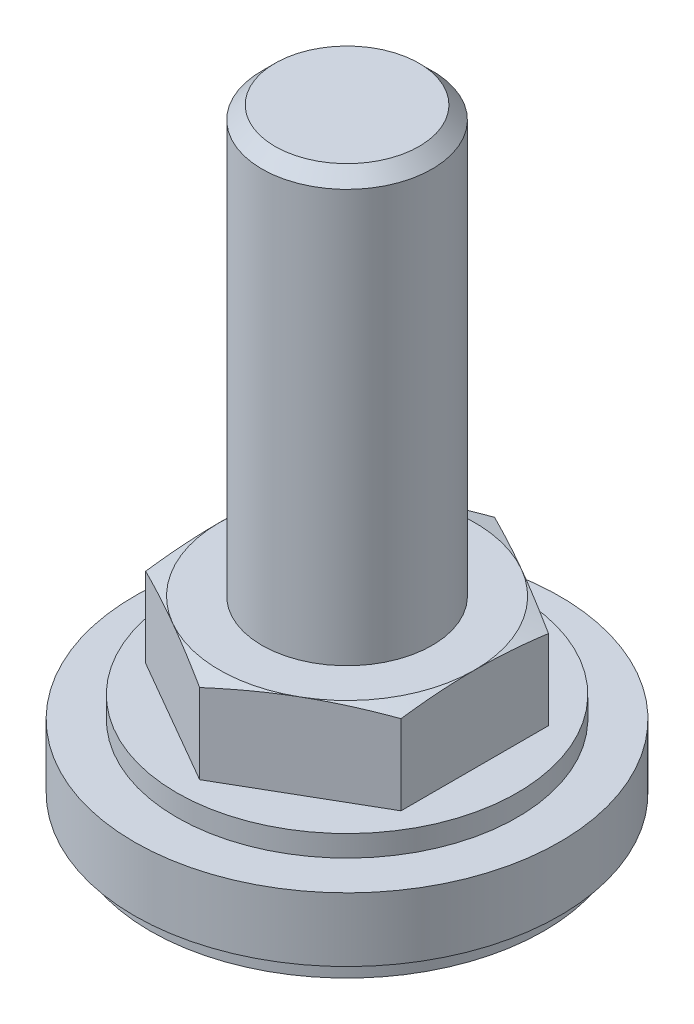
ISO-10303-21;
HEADER;
FILE_DESCRIPTION(('STEP AP214'),'2;1');
FILE_NAME('part.step','',(''),(''),'','','');
FILE_SCHEMA(('AUTOMOTIVE_DESIGN { 1 0 10303 214 1 1 1 1 }'));
ENDSEC;
DATA;
#1=APPLICATION_CONTEXT('core data for automotive mechanical design processes');
#2=APPLICATION_PROTOCOL_DEFINITION('international standard','automotive_design',2000,#1);
#3=PRODUCT_CONTEXT('',#1,'mechanical');
#4=PRODUCT('Part','Part','',(#3));
#5=PRODUCT_RELATED_PRODUCT_CATEGORY('part','',(#4));
#6=PRODUCT_DEFINITION_FORMATION('','',#4);
#7=PRODUCT_DEFINITION_CONTEXT('part definition',#1,'design');
#8=PRODUCT_DEFINITION('design','',#6,#7);
#9=PRODUCT_DEFINITION_SHAPE('','',#8);
#10=(LENGTH_UNIT() NAMED_UNIT(*) SI_UNIT(.MILLI.,.METRE.));
#11=(NAMED_UNIT(*) PLANE_ANGLE_UNIT() SI_UNIT($,.RADIAN.));
#12=(NAMED_UNIT(*) SI_UNIT($,.STERADIAN.) SOLID_ANGLE_UNIT());
#13=UNCERTAINTY_MEASURE_WITH_UNIT(LENGTH_MEASURE(1.E-05),#10,'distance_accuracy_value','');
#14=(GEOMETRIC_REPRESENTATION_CONTEXT(3) GLOBAL_UNCERTAINTY_ASSIGNED_CONTEXT((#13)) GLOBAL_UNIT_ASSIGNED_CONTEXT((#10,
#11,#12)) REPRESENTATION_CONTEXT('',''));
#15=CARTESIAN_POINT('',(0.,0.,0.));
#16=DIRECTION('',(0.,0.,1.));
#17=DIRECTION('',(1.,0.,0.));
#18=AXIS2_PLACEMENT_3D('',#15,#16,#17);
#19=CARTESIAN_POINT('',(15.,2.,0.));
#20=DIRECTION('',(0.,-1.,0.));
#21=DIRECTION('',(0.,0.,-1.));
#22=AXIS2_PLACEMENT_3D('',#19,#20,#21);
#23=PLANE('',#22);
#24=CARTESIAN_POINT('',(0.,2.,0.));
#25=DIRECTION('',(0.,1.,0.));
#26=DIRECTION('',(0.,0.,1.));
#27=AXIS2_PLACEMENT_3D('',#24,#25,#26);
#28=CIRCLE('',#27,16.);
#29=CARTESIAN_POINT('',(0.,2.,16.));
#30=VERTEX_POINT('',#29);
#31=EDGE_CURVE('E167',#30,#30,#28,.T.);
#32=ORIENTED_EDGE('',*,*,#31,.T.);
#33=EDGE_LOOP('',(#32));
#34=FACE_BOUND('',#33,.T.);
#35=DIRECTION('',(0.,0.,1.));
#36=VECTOR('',#35,1.);
#37=CARTESIAN_POINT('',(-12.,2.,-6.92820323027551));
#38=LINE('',#37,#36);
#39=CARTESIAN_POINT('',(-12.,2.,-6.92820323027551));
#40=VERTEX_POINT('',#39);
#41=CARTESIAN_POINT('',(-12.,2.,6.92820323027551));
#42=VERTEX_POINT('',#41);
#43=EDGE_CURVE('E128',#40,#42,#38,.T.);
#44=ORIENTED_EDGE('',*,*,#43,.F.);
#45=DIRECTION('',(-0.866025403784439,0.,0.5));
#46=VECTOR('',#45,1.);
#47=CARTESIAN_POINT('',(0.,2.,-13.856406460551));
#48=LINE('',#47,#46);
#49=CARTESIAN_POINT('',(0.,2.,-13.856406460551));
#50=VERTEX_POINT('',#49);
#51=EDGE_CURVE('E143',#50,#40,#48,.T.);
#52=ORIENTED_EDGE('',*,*,#51,.F.);
#53=DIRECTION('',(-0.866025403784439,0.,-0.5));
#54=VECTOR('',#53,1.);
#55=CARTESIAN_POINT('',(12.,2.,-6.92820323027551));
#56=LINE('',#55,#54);
#57=CARTESIAN_POINT('',(12.,2.,-6.92820323027551));
#58=VERTEX_POINT('',#57);
#59=EDGE_CURVE('E140',#58,#50,#56,.T.);
#60=ORIENTED_EDGE('',*,*,#59,.F.);
#61=DIRECTION('',(0.,0.,-1.));
#62=VECTOR('',#61,1.);
#63=CARTESIAN_POINT('',(12.,2.,6.92820323027551));
#64=LINE('',#63,#62);
#65=CARTESIAN_POINT('',(12.,2.,6.92820323027551));
#66=VERTEX_POINT('',#65);
#67=EDGE_CURVE('E137',#66,#58,#64,.T.);
#68=ORIENTED_EDGE('',*,*,#67,.F.);
#69=DIRECTION('',(0.866025403784439,0.,-0.5));
#70=VECTOR('',#69,1.);
#71=CARTESIAN_POINT('',(0.,2.,13.856406460551));
#72=LINE('',#71,#70);
#73=CARTESIAN_POINT('',(0.,2.,13.856406460551));
#74=VERTEX_POINT('',#73);
#75=EDGE_CURVE('E131',#74,#66,#72,.T.);
#76=ORIENTED_EDGE('',*,*,#75,.F.);
#77=DIRECTION('',(0.866025403784439,0.,0.5));
#78=VECTOR('',#77,1.);
#79=CARTESIAN_POINT('',(-12.,2.,6.92820323027551));
#80=LINE('',#79,#78);
#81=EDGE_CURVE('E117',#42,#74,#80,.T.);
#82=ORIENTED_EDGE('',*,*,#81,.F.);
#83=EDGE_LOOP('',(#44,#52,#60,#68,#76,#82));
#84=FACE_BOUND('',#83,.T.);
#85=ADVANCED_FACE('F39',(#34,#84),#23,.F.);
#86=CARTESIAN_POINT('',(0.,-8.,0.));
#87=DIRECTION('',(0.,1.,0.));
#88=DIRECTION('',(0.,0.,1.));
#89=AXIS2_PLACEMENT_3D('',#86,#87,#88);
#90=CYLINDRICAL_SURFACE('',#89,16.);
#91=ORIENTED_EDGE('',*,*,#31,.F.);
#92=EDGE_LOOP('',(#91));
#93=FACE_BOUND('',#92,.T.);
#94=CARTESIAN_POINT('',(0.,0.,0.));
#95=DIRECTION('',(0.,1.,0.));
#96=DIRECTION('',(0.,0.,1.));
#97=AXIS2_PLACEMENT_3D('',#94,#95,#96);
#98=CIRCLE('',#97,16.);
#99=CARTESIAN_POINT('',(0.,0.,16.));
#100=VERTEX_POINT('',#99);
#101=EDGE_CURVE('E164',#100,#100,#98,.T.);
#102=ORIENTED_EDGE('',*,*,#101,.T.);
#103=EDGE_LOOP('',(#102));
#104=FACE_BOUND('',#103,.T.);
#105=ADVANCED_FACE('F261',(#93,#104),#90,.T.);
#106=CARTESIAN_POINT('',(16.,0.,0.));
#107=DIRECTION('',(0.,-1.,0.));
#108=DIRECTION('',(0.,0.,-1.));
#109=AXIS2_PLACEMENT_3D('',#106,#107,#108);
#110=PLANE('',#109);
#111=ORIENTED_EDGE('',*,*,#101,.F.);
#112=EDGE_LOOP('',(#111));
#113=FACE_BOUND('',#112,.T.);
#114=CARTESIAN_POINT('',(0.,0.,0.));
#115=DIRECTION('',(0.,1.,0.));
#116=DIRECTION('',(0.,0.,1.));
#117=AXIS2_PLACEMENT_3D('',#114,#115,#116);
#118=CIRCLE('',#117,20.);
#119=CARTESIAN_POINT('',(0.,0.,20.));
#120=VERTEX_POINT('',#119);
#121=EDGE_CURVE('E161',#120,#120,#118,.T.);
#122=ORIENTED_EDGE('',*,*,#121,.T.);
#123=EDGE_LOOP('',(#122));
#124=FACE_BOUND('',#123,.T.);
#125=ADVANCED_FACE('F257',(#113,#124),#110,.F.);
#126=CARTESIAN_POINT('',(0.,-8.,0.));
#127=DIRECTION('',(0.,1.,0.));
#128=DIRECTION('',(0.,0.,1.));
#129=AXIS2_PLACEMENT_3D('',#126,#127,#128);
#130=CYLINDRICAL_SURFACE('',#129,20.);
#131=ORIENTED_EDGE('',*,*,#121,.F.);
#132=EDGE_LOOP('',(#131));
#133=FACE_BOUND('',#132,.T.);
#134=CARTESIAN_POINT('',(0.,-6.,0.));
#135=DIRECTION('',(0.,1.,0.));
#136=DIRECTION('',(0.,0.,1.));
#137=AXIS2_PLACEMENT_3D('',#134,#135,#136);
#138=CIRCLE('',#137,20.);
#139=CARTESIAN_POINT('',(0.,-6.,20.));
#140=VERTEX_POINT('',#139);
#141=EDGE_CURVE('E158',#140,#140,#138,.T.);
#142=ORIENTED_EDGE('',*,*,#141,.T.);
#143=EDGE_LOOP('',(#142));
#144=FACE_BOUND('',#143,.T.);
#145=ADVANCED_FACE('F253',(#133,#144),#130,.T.);
#146=CARTESIAN_POINT('',(20.,-6.,0.));
#147=DIRECTION('',(0.,1.,0.));
#148=DIRECTION('',(0.,0.,1.));
#149=AXIS2_PLACEMENT_3D('',#146,#147,#148);
#150=PLANE('',#149);
#151=ORIENTED_EDGE('',*,*,#141,.F.);
#152=EDGE_LOOP('',(#151));
#153=FACE_BOUND('',#152,.T.);
#154=CARTESIAN_POINT('',(0.,-6.,0.));
#155=DIRECTION('',(0.,1.,0.));
#156=DIRECTION('',(0.,0.,1.));
#157=AXIS2_PLACEMENT_3D('',#154,#155,#156);
#158=CIRCLE('',#157,18.5);
#159=CARTESIAN_POINT('',(0.,-6.,18.5));
#160=VERTEX_POINT('',#159);
#161=EDGE_CURVE('E155',#160,#160,#158,.T.);
#162=ORIENTED_EDGE('',*,*,#161,.T.);
#163=EDGE_LOOP('',(#162));
#164=FACE_BOUND('',#163,.T.);
#165=ADVANCED_FACE('F249',(#153,#164),#150,.F.);
#166=CARTESIAN_POINT('',(0.,-8.,0.));
#167=DIRECTION('',(0.,1.,0.));
#168=DIRECTION('',(0.,0.,1.));
#169=AXIS2_PLACEMENT_3D('',#166,#167,#168);
#170=CYLINDRICAL_SURFACE('',#169,18.5);
#171=ORIENTED_EDGE('',*,*,#161,.F.);
#172=EDGE_LOOP('',(#171));
#173=FACE_BOUND('',#172,.T.);
#174=CARTESIAN_POINT('',(0.,-8.,0.));
#175=DIRECTION('',(0.,1.,0.));
#176=DIRECTION('',(0.,0.,1.));
#177=AXIS2_PLACEMENT_3D('',#174,#175,#176);
#178=CIRCLE('',#177,18.5);
#179=CARTESIAN_POINT('',(0.,-8.,18.5));
#180=VERTEX_POINT('',#179);
#181=EDGE_CURVE('E121',#180,#180,#178,.T.);
#182=ORIENTED_EDGE('',*,*,#181,.T.);
#183=EDGE_LOOP('',(#182));
#184=FACE_BOUND('',#183,.T.);
#185=ADVANCED_FACE('F245',(#173,#184),#170,.T.);
#186=CARTESIAN_POINT('',(18.5,-8.,0.));
#187=DIRECTION('',(0.,1.,0.));
#188=DIRECTION('',(0.,0.,1.));
#189=AXIS2_PLACEMENT_3D('',#186,#187,#188);
#190=PLANE('',#189);
#191=ORIENTED_EDGE('',*,*,#181,.F.);
#192=EDGE_LOOP('',(#191));
#193=FACE_BOUND('',#192,.T.);
#194=ADVANCED_FACE('F242',(#193),#190,.F.);
#195=CARTESIAN_POINT('',(-12.,12.,-6.92820323027551));
#196=DIRECTION('',(1.,0.,0.));
#197=DIRECTION('',(0.,0.,-1.));
#198=AXIS2_PLACEMENT_3D('',#195,#196,#197);
#199=PLANE('',#198);
#200=DIRECTION('',(0.,-1.,0.));
#201=VECTOR('',#200,1.);
#202=CARTESIAN_POINT('',(-12.,12.,-6.92820323027551));
#203=LINE('',#202,#201);
#204=CARTESIAN_POINT('',(-12.,9.50257738807144,-6.92820323027551));
#205=VERTEX_POINT('',#204);
#206=EDGE_CURVE('E59',#205,#40,#203,.T.);
#207=ORIENTED_EDGE('',*,*,#206,.T.);
#208=ORIENTED_EDGE('',*,*,#43,.T.);
#209=DIRECTION('',(0.,-1.,0.));
#210=VECTOR('',#209,1.);
#211=CARTESIAN_POINT('',(-12.,12.,6.92820323027551));
#212=LINE('',#211,#210);
#213=CARTESIAN_POINT('',(-12.,9.50257738807144,6.92820323027551));
#214=VERTEX_POINT('',#213);
#215=EDGE_CURVE('E113',#214,#42,#212,.T.);
#216=ORIENTED_EDGE('',*,*,#215,.F.);
#217=CARTESIAN_POINT('',(-12.,7.34291336878938,-18.3392424451288));
#218=CARTESIAN_POINT('',(-12.,7.46497416598965,-17.7947049298608));
#219=CARTESIAN_POINT('',(-12.,7.58554409265667,-17.2498271442394));
#220=CARTESIAN_POINT('',(-12.,7.82289745119736,-16.1592238953871));
#221=CARTESIAN_POINT('',(-12.,7.93968071989154,-15.6134983966846));
#222=CARTESIAN_POINT('',(-12.,8.16875730516589,-14.5205453408895));
#223=CARTESIAN_POINT('',(-12.,8.28104611977105,-13.9733168368444));
#224=CARTESIAN_POINT('',(-12.,8.49992361427316,-12.8777216682163));
#225=CARTESIAN_POINT('',(-12.,8.60651234215723,-12.3293550132554));
#226=CARTESIAN_POINT('',(-12.,8.81180976479951,-11.2356630729952));
#227=CARTESIAN_POINT('',(-12.,8.91057446126407,-10.6903483516512));
#228=CARTESIAN_POINT('',(-12.,9.09949648601528,-9.59821809665814));
#229=CARTESIAN_POINT('',(-12.,9.18965378238088,-9.05140255745102));
#230=CARTESIAN_POINT('',(-12.,9.35932947152392,-7.95618411484281));
#231=CARTESIAN_POINT('',(-12.,9.43884929024633,-7.40778143428583));
#232=CARTESIAN_POINT('',(-12.,9.58491017293834,-6.30923056644194));
#233=CARTESIAN_POINT('',(-12.,9.65145122425651,-5.75908237745407));
#234=CARTESIAN_POINT('',(-12.,9.76967287965022,-4.65082902866329));
#235=CARTESIAN_POINT('',(-12.,9.82117560154871,-4.09270460781781));
#236=CARTESIAN_POINT('',(-12.,9.90576919917668,-2.97505012677679));
#237=CARTESIAN_POINT('',(-12.,9.93886049717467,-2.41552009911472));
#238=CARTESIAN_POINT('',(-12.,9.98470135997272,-1.29586637312656));
#239=CARTESIAN_POINT('',(-12.,9.99746021195907,-0.735743062852366));
#240=CARTESIAN_POINT('',(-12.,10.0018514734413,0.384587539379178));
#241=CARTESIAN_POINT('',(-12.,9.99348390320361,0.944794831255455));
#242=CARTESIAN_POINT('',(-12.,9.95609280857339,2.06654492461965));
#243=CARTESIAN_POINT('',(-12.,9.92699428380419,2.62808517501098));
#244=CARTESIAN_POINT('',(-12.,9.84980336617103,3.74984659854216));
#245=CARTESIAN_POINT('',(-12.,9.80171055196485,4.31006774214349));
#246=CARTESIAN_POINT('',(-12.,9.68896323837323,5.42918593727119));
#247=CARTESIAN_POINT('',(-12.,9.62429790423961,5.98808188023556));
#248=CARTESIAN_POINT('',(-12.,9.4810999066988,7.10407465120835));
#249=CARTESIAN_POINT('',(-12.,9.40256719974487,7.66117147356152));
#250=CARTESIAN_POINT('',(-12.,9.23961453136396,8.73752812609933));
#251=CARTESIAN_POINT('',(-12.,9.15590747706429,9.25689698586229));
#252=CARTESIAN_POINT('',(-12.,8.98035073248432,10.294263454863));
#253=CARTESIAN_POINT('',(-12.,8.88850081864786,10.8122610260507));
#254=CARTESIAN_POINT('',(-12.,8.69814696950544,11.8470802784051));
#255=CARTESIAN_POINT('',(-12.,8.59964236069907,12.3639018350633));
#256=CARTESIAN_POINT('',(-12.,8.39720736973758,13.3964724543178));
#257=CARTESIAN_POINT('',(-12.,8.29327703700343,13.9122215266385));
#258=CARTESIAN_POINT('',(-12.,8.08094711168316,14.9429248833211));
#259=CARTESIAN_POINT('',(-12.,7.97254645648657,15.4578789481757));
#260=CARTESIAN_POINT('',(-12.,7.75207795037087,16.4870026127467));
#261=CARTESIAN_POINT('',(-12.,7.64001007807679,17.0011722078723));
#262=CARTESIAN_POINT('',(-12.,7.29929681010787,18.5426103722024));
#263=CARTESIAN_POINT('',(-12.,7.06612711042525,19.5688785132233));
#264=CARTESIAN_POINT('',(-12.,6.59370922187564,21.6093738155767));
#265=CARTESIAN_POINT('',(-12.,6.35454333578601,22.6236201570885));
#266=CARTESIAN_POINT('',(-12.,5.8702257601212,24.6506997888533));
#267=CARTESIAN_POINT('',(-12.,5.62507396088436,25.6635330528589));
#268=CARTESIAN_POINT('',(-12.,5.1306458534958,27.6868599239905));
#269=CARTESIAN_POINT('',(-12.,4.88137503425515,28.6973548750466));
#270=CARTESIAN_POINT('',(-12.,4.50495264739508,30.2124536801021));
#271=CARTESIAN_POINT('',(-12.,4.37906121183352,30.7173711972522));
#272=CARTESIAN_POINT('',(-12.,4.12653530428738,31.7270198362654));
#273=CARTESIAN_POINT('',(-12.,3.99990083310313,32.2317509583285));
#274=CARTESIAN_POINT('',(-12.,3.87294319801609,32.7364007742963));
#275=B_SPLINE_CURVE_WITH_KNOTS('',3,(#217,#218,#219,#220,#221,#222,#223,#224,#225,#226,#227,
#228,#229,#230,#231,#232,#233,#234,#235,#236,#237,#238,#239,#240,#241,#242,#243,#244,#245,#246,
#247,#248,#249,#250,#251,#252,#253,#254,#255,#256,#257,#258,#259,#260,#261,#262,#263,#264,#265,
#266,#267,#268,#269,#270,#271,#272,#273,#274),.UNSPECIFIED.,.F.,.F.,(4,2,2,2,2,2,2,2,2,2,2,2,2,
2,2,2,2,2,2,2,2,2,2,2,2,2,2,2,4),(0.,1.67415717844079,3.34838640617016,5.02425271091023,
6.70010490486635,8.36260910905425,10.0251194784959,11.6874067660145,13.3496956738876,
15.030916953375,16.7120996722342,18.3925142623134,20.0729272403843,21.7594506855859,
23.4460115443176,25.1336778647815,26.8213494849987,28.3994866240126,29.977667103039,
31.5560075446455,33.134333612225,34.7130370404334,36.2917496720076,39.4489598327135,
42.5751286078004,45.7013546972023,48.8237058684811,50.3848310405374,51.9459545314085),.UNSPECIFIED.);
#276=CARTESIAN_POINT('',(-12.,10.,0.));
#277=VERTEX_POINT('',#276);
#278=EDGE_CURVE('E43',#277,#214,#275,.T.);
#279=ORIENTED_EDGE('',*,*,#278,.F.);
#280=EDGE_CURVE('E11',#205,#277,#275,.T.);
#281=ORIENTED_EDGE('',*,*,#280,.F.);
#282=EDGE_LOOP('',(#207,#208,#216,#279,#281));
#283=FACE_BOUND('',#282,.T.);
#284=ADVANCED_FACE('F133',(#283),#199,.F.);
#285=CARTESIAN_POINT('',(-12.,12.,6.92820323027551));
#286=DIRECTION('',(0.5,0.,-0.866025403784439));
#287=DIRECTION('',(-0.866025403784439,0.,-0.5));
#288=AXIS2_PLACEMENT_3D('',#285,#286,#287);
#289=PLANE('',#288);
#290=ORIENTED_EDGE('',*,*,#215,.T.);
#291=ORIENTED_EDGE('',*,*,#81,.T.);
#292=DIRECTION('',(0.,-1.,0.));
#293=VECTOR('',#292,1.);
#294=CARTESIAN_POINT('',(0.,12.,13.856406460551));
#295=LINE('',#294,#293);
#296=CARTESIAN_POINT('',(0.,9.50257738807144,13.856406460551));
#297=VERTEX_POINT('',#296);
#298=EDGE_CURVE('E122',#297,#74,#295,.T.);
#299=ORIENTED_EDGE('',*,*,#298,.F.);
#300=CARTESIAN_POINT('',(-12.0002,9.50254644757701,6.92808776022167));
#301=CARTESIAN_POINT('',(-11.5018535458174,9.57967201341546,7.21580821969369));
#302=CARTESIAN_POINT('',(-11.0026035553764,9.64968920259279,7.50405033606775));
#303=CARTESIAN_POINT('',(-10.0023405010804,9.7727027206488,8.08155247972595));
#304=CARTESIAN_POINT('',(-9.50132680443088,9.82569213655645,8.37081287235424));
#305=CARTESIAN_POINT('',(-8.50057386663493,9.91155672804192,8.94859785038305));
#306=CARTESIAN_POINT('',(-8.00084139202275,9.94453429696096,9.23711852912318));
#307=CARTESIAN_POINT('',(-7.00073918358372,9.98875383045164,9.8145278083826));
#308=CARTESIAN_POINT('',(-6.50036959179186,10.,10.1034163268979));
#309=CARTESIAN_POINT('',(-5.49963040820814,10.,10.6811933639286));
#310=CARTESIAN_POINT('',(-4.99926081641628,9.98875383045164,10.9700818824439));
#311=CARTESIAN_POINT('',(-3.99915860797725,9.94453429696096,11.5474911617033));
#312=CARTESIAN_POINT('',(-3.49942613336507,9.91155672804192,11.8360118404435));
#313=CARTESIAN_POINT('',(-2.49867319556912,9.82569213655645,12.4137968184723));
#314=CARTESIAN_POINT('',(-1.99765949891959,9.7727027206488,12.7030572111006));
#315=CARTESIAN_POINT('',(-0.997396444623651,9.64968920259279,13.2805593547588));
#316=CARTESIAN_POINT('',(-0.498146454182601,9.57967201341546,13.5688014711328));
#317=CARTESIAN_POINT('',(0.00019999999999816,9.50254644757701,13.8565219306049));
#318=B_SPLINE_CURVE_WITH_KNOTS('',3,(#300,#301,#302,#303,#304,#305,#306,#307,#308,#309,#310,
#311,#312,#313,#314,#315,#316,#317),.UNSPECIFIED.,.F.,.F.,(4,2,2,2,2,2,2,2,4),(0.,
1.74185054469228,3.48440735870376,5.21797126724055,6.95119970147062,8.6844281357007,
10.4179920442375,12.160548858249,13.9023994029412),.UNSPECIFIED.);
#319=CARTESIAN_POINT('',(-6.,10.,10.3923048454133));
#320=VERTEX_POINT('',#319);
#321=EDGE_CURVE('E232',#320,#297,#318,.T.);
#322=ORIENTED_EDGE('',*,*,#321,.F.);
#323=EDGE_CURVE('E119',#214,#320,#318,.T.);
#324=ORIENTED_EDGE('',*,*,#323,.F.);
#325=EDGE_LOOP('',(#290,#291,#299,#322,#324));
#326=FACE_BOUND('',#325,.T.);
#327=ADVANCED_FACE('F115',(#326),#289,.F.);
#328=CARTESIAN_POINT('',(0.,12.,13.856406460551));
#329=DIRECTION('',(-0.5,0.,-0.866025403784439));
#330=DIRECTION('',(-0.866025403784439,0.,0.5));
#331=AXIS2_PLACEMENT_3D('',#328,#329,#330);
#332=PLANE('',#331);
#333=ORIENTED_EDGE('',*,*,#298,.T.);
#334=ORIENTED_EDGE('',*,*,#75,.T.);
#335=DIRECTION('',(0.,-1.,0.));
#336=VECTOR('',#335,1.);
#337=CARTESIAN_POINT('',(12.,12.,6.92820323027551));
#338=LINE('',#337,#336);
#339=CARTESIAN_POINT('',(12.,9.50257738807144,6.92820323027551));
#340=VERTEX_POINT('',#339);
#341=EDGE_CURVE('E150',#340,#66,#338,.T.);
#342=ORIENTED_EDGE('',*,*,#341,.F.);
#343=CARTESIAN_POINT('',(-0.000200000000000077,9.50254644757701,13.8565219306049));
#344=CARTESIAN_POINT('',(0.498146454182599,9.57967201341546,13.5688014711328));
#345=CARTESIAN_POINT('',(0.997396444623648,9.64968920259279,13.2805593547588));
#346=CARTESIAN_POINT('',(1.99765949891959,9.7727027206488,12.7030572111006));
#347=CARTESIAN_POINT('',(2.49867319556912,9.82569213655645,12.4137968184723));
#348=CARTESIAN_POINT('',(3.49942613336507,9.91155672804192,11.8360118404435));
#349=CARTESIAN_POINT('',(3.99915860797725,9.94453429696096,11.5474911617033));
#350=CARTESIAN_POINT('',(4.99926081641628,9.98875383045164,10.9700818824439));
#351=CARTESIAN_POINT('',(5.49963040820814,10.,10.6811933639286));
#352=CARTESIAN_POINT('',(6.50036959179186,10.,10.1034163268979));
#353=CARTESIAN_POINT('',(7.00073918358372,9.98875383045164,9.8145278083826));
#354=CARTESIAN_POINT('',(8.00084139202275,9.94453429696096,9.23711852912318));
#355=CARTESIAN_POINT('',(8.50057386663493,9.91155672804192,8.94859785038305));
#356=CARTESIAN_POINT('',(9.50132680443088,9.82569213655645,8.37081287235424));
#357=CARTESIAN_POINT('',(10.0023405010804,9.7727027206488,8.08155247972595));
#358=CARTESIAN_POINT('',(11.0026035553764,9.64968920259279,7.50405033606775));
#359=CARTESIAN_POINT('',(11.5018535458174,9.57967201341546,7.21580821969369));
#360=CARTESIAN_POINT('',(12.0002,9.50254644757701,6.92808776022167));
#361=B_SPLINE_CURVE_WITH_KNOTS('',3,(#343,#344,#345,#346,#347,#348,#349,#350,#351,#352,#353,
#354,#355,#356,#357,#358,#359,#360),.UNSPECIFIED.,.F.,.F.,(4,2,2,2,2,2,2,2,4),(0.,
1.74185054469228,3.48440735870376,5.21797126724055,6.95119970147062,8.68442813570069,
10.4179920442375,12.160548858249,13.9023994029412),.UNSPECIFIED.);
#362=CARTESIAN_POINT('',(6.,10.,10.3923048454133));
#363=VERTEX_POINT('',#362);
#364=EDGE_CURVE('E226',#363,#340,#361,.T.);
#365=ORIENTED_EDGE('',*,*,#364,.F.);
#366=EDGE_CURVE('E231',#297,#363,#361,.T.);
#367=ORIENTED_EDGE('',*,*,#366,.F.);
#368=EDGE_LOOP('',(#333,#334,#342,#365,#367));
#369=FACE_BOUND('',#368,.T.);
#370=ADVANCED_FACE('F214',(#369),#332,.F.);
#371=CARTESIAN_POINT('',(12.,12.,6.92820323027551));
#372=DIRECTION('',(-1.,0.,0.));
#373=DIRECTION('',(0.,0.,1.));
#374=AXIS2_PLACEMENT_3D('',#371,#372,#373);
#375=PLANE('',#374);
#376=ORIENTED_EDGE('',*,*,#341,.T.);
#377=ORIENTED_EDGE('',*,*,#67,.T.);
#378=DIRECTION('',(0.,-1.,0.));
#379=VECTOR('',#378,1.);
#380=CARTESIAN_POINT('',(12.,12.,-6.92820323027551));
#381=LINE('',#380,#379);
#382=CARTESIAN_POINT('',(12.,9.50257738807144,-6.92820323027551));
#383=VERTEX_POINT('',#382);
#384=EDGE_CURVE('E148',#383,#58,#381,.T.);
#385=ORIENTED_EDGE('',*,*,#384,.F.);
#386=CARTESIAN_POINT('',(12.,7.34291336878938,-18.3392424451288));
#387=CARTESIAN_POINT('',(12.,7.46497416598965,-17.7947049298608));
#388=CARTESIAN_POINT('',(12.,7.58554409265667,-17.2498271442394));
#389=CARTESIAN_POINT('',(12.,7.82289745119736,-16.1592238953871));
#390=CARTESIAN_POINT('',(12.,7.93968071989154,-15.6134983966846));
#391=CARTESIAN_POINT('',(12.,8.16875730516589,-14.5205453408895));
#392=CARTESIAN_POINT('',(12.,8.28104611977105,-13.9733168368444));
#393=CARTESIAN_POINT('',(12.,8.49992361427316,-12.8777216682163));
#394=CARTESIAN_POINT('',(12.,8.60651234215723,-12.3293550132554));
#395=CARTESIAN_POINT('',(12.,8.81180976479951,-11.2356630729952));
#396=CARTESIAN_POINT('',(12.,8.91057446126407,-10.6903483516512));
#397=CARTESIAN_POINT('',(12.,9.09949648601528,-9.59821809665814));
#398=CARTESIAN_POINT('',(12.,9.18965378238088,-9.05140255745102));
#399=CARTESIAN_POINT('',(12.,9.35932947152392,-7.95618411484281));
#400=CARTESIAN_POINT('',(12.,9.43884929024633,-7.40778143428583));
#401=CARTESIAN_POINT('',(12.,9.58491017293834,-6.30923056644194));
#402=CARTESIAN_POINT('',(12.,9.65145122425651,-5.75908237745407));
#403=CARTESIAN_POINT('',(12.,9.76967287965022,-4.65082902866329));
#404=CARTESIAN_POINT('',(12.,9.82117560154871,-4.09270460781781));
#405=CARTESIAN_POINT('',(12.,9.90576919917668,-2.97505012677679));
#406=CARTESIAN_POINT('',(12.,9.93886049717467,-2.41552009911472));
#407=CARTESIAN_POINT('',(12.,9.98470135997272,-1.29586637312656));
#408=CARTESIAN_POINT('',(12.,9.99746021195907,-0.735743062852366));
#409=CARTESIAN_POINT('',(12.,10.0018514734413,0.384587539379178));
#410=CARTESIAN_POINT('',(12.,9.99348390320361,0.944794831255455));
#411=CARTESIAN_POINT('',(12.,9.95609280857339,2.06654492461965));
#412=CARTESIAN_POINT('',(12.,9.92699428380419,2.62808517501098));
#413=CARTESIAN_POINT('',(12.,9.84980336617103,3.74984659854216));
#414=CARTESIAN_POINT('',(12.,9.80171055196485,4.31006774214349));
#415=CARTESIAN_POINT('',(12.,9.68896323837323,5.42918593727119));
#416=CARTESIAN_POINT('',(12.,9.62429790423961,5.98808188023556));
#417=CARTESIAN_POINT('',(12.,9.4810999066988,7.10407465120835));
#418=CARTESIAN_POINT('',(12.,9.40256719974487,7.66117147356152));
#419=CARTESIAN_POINT('',(12.,9.23961453136396,8.73752812609933));
#420=CARTESIAN_POINT('',(12.,9.15590747706429,9.25689698586229));
#421=CARTESIAN_POINT('',(12.,8.98035073248432,10.294263454863));
#422=CARTESIAN_POINT('',(12.,8.88850081864786,10.8122610260507));
#423=CARTESIAN_POINT('',(12.,8.69814696950544,11.8470802784051));
#424=CARTESIAN_POINT('',(12.,8.59964236069907,12.3639018350633));
#425=CARTESIAN_POINT('',(12.,8.39720736973758,13.3964724543178));
#426=CARTESIAN_POINT('',(12.,8.29327703700343,13.9122215266385));
#427=CARTESIAN_POINT('',(12.,8.08094711168316,14.9429248833211));
#428=CARTESIAN_POINT('',(12.,7.97254645648657,15.4578789481757));
#429=CARTESIAN_POINT('',(12.,7.75207795037087,16.4870026127467));
#430=CARTESIAN_POINT('',(12.,7.64001007807679,17.0011722078723));
#431=CARTESIAN_POINT('',(12.,7.29929681010787,18.5426103722024));
#432=CARTESIAN_POINT('',(12.,7.06612711042525,19.5688785132233));
#433=CARTESIAN_POINT('',(12.,6.59370922187564,21.6093738155767));
#434=CARTESIAN_POINT('',(12.,6.35454333578601,22.6236201570885));
#435=CARTESIAN_POINT('',(12.,5.8702257601212,24.6506997888533));
#436=CARTESIAN_POINT('',(12.,5.62507396088436,25.6635330528589));
#437=CARTESIAN_POINT('',(12.,5.1306458534958,27.6868599239905));
#438=CARTESIAN_POINT('',(12.,4.88137503425515,28.6973548750466));
#439=CARTESIAN_POINT('',(12.,4.50495264739508,30.2124536801021));
#440=CARTESIAN_POINT('',(12.,4.37906121183352,30.7173711972522));
#441=CARTESIAN_POINT('',(12.,4.12653530428738,31.7270198362654));
#442=CARTESIAN_POINT('',(12.,3.99990083310313,32.2317509583285));
#443=CARTESIAN_POINT('',(12.,3.87294319801609,32.7364007742963));
#444=B_SPLINE_CURVE_WITH_KNOTS('',3,(#386,#387,#388,#389,#390,#391,#392,#393,#394,#395,#396,
#397,#398,#399,#400,#401,#402,#403,#404,#405,#406,#407,#408,#409,#410,#411,#412,#413,#414,#415,
#416,#417,#418,#419,#420,#421,#422,#423,#424,#425,#426,#427,#428,#429,#430,#431,#432,#433,#434,
#435,#436,#437,#438,#439,#440,#441,#442,#443),.UNSPECIFIED.,.F.,.F.,(4,2,2,2,2,2,2,2,2,2,2,2,2,
2,2,2,2,2,2,2,2,2,2,2,2,2,2,2,4),(0.,1.67415717844079,3.34838640617016,5.02425271091023,
6.70010490486635,8.36260910905425,10.0251194784959,11.6874067660145,13.3496956738876,
15.030916953375,16.7120996722342,18.3925142623134,20.0729272403843,21.7594506855859,
23.4460115443176,25.1336778647815,26.8213494849987,28.3994866240126,29.977667103039,
31.5560075446455,33.134333612225,34.7130370404334,36.2917496720076,39.4489598327135,
42.5751286078004,45.7013546972023,48.8237058684811,50.3848310405374,51.9459545314085),.UNSPECIFIED.);
#445=CARTESIAN_POINT('',(12.,10.,0.));
#446=VERTEX_POINT('',#445);
#447=EDGE_CURVE('E218',#446,#383,#444,.F.);
#448=ORIENTED_EDGE('',*,*,#447,.F.);
#449=EDGE_CURVE('E224',#340,#446,#444,.F.);
#450=ORIENTED_EDGE('',*,*,#449,.F.);
#451=EDGE_LOOP('',(#376,#377,#385,#448,#450));
#452=FACE_BOUND('',#451,.T.);
#453=ADVANCED_FACE('F209',(#452),#375,.F.);
#454=CARTESIAN_POINT('',(12.,12.,-6.92820323027551));
#455=DIRECTION('',(-0.5,0.,0.866025403784439));
#456=DIRECTION('',(0.866025403784439,0.,0.5));
#457=AXIS2_PLACEMENT_3D('',#454,#455,#456);
#458=PLANE('',#457);
#459=ORIENTED_EDGE('',*,*,#384,.T.);
#460=ORIENTED_EDGE('',*,*,#59,.T.);
#461=DIRECTION('',(0.,-1.,0.));
#462=VECTOR('',#461,1.);
#463=CARTESIAN_POINT('',(0.,12.,-13.856406460551));
#464=LINE('',#463,#462);
#465=CARTESIAN_POINT('',(0.,9.50257738807144,-13.856406460551));
#466=VERTEX_POINT('',#465);
#467=EDGE_CURVE('E146',#466,#50,#464,.T.);
#468=ORIENTED_EDGE('',*,*,#467,.F.);
#469=CARTESIAN_POINT('',(12.0002,9.50254644757701,-6.92808776022167));
#470=CARTESIAN_POINT('',(11.5018535458174,9.57967201341546,-7.21580821969369));
#471=CARTESIAN_POINT('',(11.0026035553764,9.64968920259279,-7.50405033606775));
#472=CARTESIAN_POINT('',(10.0023405010804,9.7727027206488,-8.08155247972595));
#473=CARTESIAN_POINT('',(9.50132680443088,9.82569213655645,-8.37081287235424));
#474=CARTESIAN_POINT('',(8.50057386663493,9.91155672804192,-8.94859785038305));
#475=CARTESIAN_POINT('',(8.00084139202275,9.94453429696096,-9.23711852912318));
#476=CARTESIAN_POINT('',(7.00073918358372,9.98875383045164,-9.8145278083826));
#477=CARTESIAN_POINT('',(6.50036959179186,10.,-10.1034163268979));
#478=CARTESIAN_POINT('',(5.49963040820814,10.,-10.6811933639286));
#479=CARTESIAN_POINT('',(4.99926081641628,9.98875383045164,-10.9700818824439));
#480=CARTESIAN_POINT('',(3.99915860797725,9.94453429696096,-11.5474911617033));
#481=CARTESIAN_POINT('',(3.49942613336507,9.91155672804192,-11.8360118404435));
#482=CARTESIAN_POINT('',(2.49867319556912,9.82569213655645,-12.4137968184723));
#483=CARTESIAN_POINT('',(1.99765949891959,9.7727027206488,-12.7030572111006));
#484=CARTESIAN_POINT('',(0.997396444623651,9.64968920259279,-13.2805593547588));
#485=CARTESIAN_POINT('',(0.498146454182601,9.57967201341546,-13.5688014711328));
#486=CARTESIAN_POINT('',(-0.00019999999999816,9.50254644757701,-13.8565219306049));
#487=B_SPLINE_CURVE_WITH_KNOTS('',3,(#469,#470,#471,#472,#473,#474,#475,#476,#477,#478,#479,
#480,#481,#482,#483,#484,#485,#486),.UNSPECIFIED.,.F.,.F.,(4,2,2,2,2,2,2,2,4),(0.,
1.74185054469228,3.48440735870376,5.21797126724055,6.95119970147062,8.6844281357007,
10.4179920442375,12.160548858249,13.9023994029412),.UNSPECIFIED.);
#488=CARTESIAN_POINT('',(6.,10.,-10.3923048454133));
#489=VERTEX_POINT('',#488);
#490=EDGE_CURVE('E192',#489,#466,#487,.T.);
#491=ORIENTED_EDGE('',*,*,#490,.F.);
#492=EDGE_CURVE('E225',#383,#489,#487,.T.);
#493=ORIENTED_EDGE('',*,*,#492,.F.);
#494=EDGE_LOOP('',(#459,#460,#468,#491,#493));
#495=FACE_BOUND('',#494,.T.);
#496=ADVANCED_FACE('F205',(#495),#458,.F.);
#497=CARTESIAN_POINT('',(0.,12.,-13.856406460551));
#498=DIRECTION('',(0.5,0.,0.866025403784439));
#499=DIRECTION('',(0.866025403784439,0.,-0.5));
#500=AXIS2_PLACEMENT_3D('',#497,#498,#499);
#501=PLANE('',#500);
#502=ORIENTED_EDGE('',*,*,#467,.T.);
#503=ORIENTED_EDGE('',*,*,#51,.T.);
#504=ORIENTED_EDGE('',*,*,#206,.F.);
#505=CARTESIAN_POINT('',(0.000200000000000077,9.50254644757701,-13.8565219306049));
#506=CARTESIAN_POINT('',(-0.498146454182599,9.57967201341546,-13.5688014711328));
#507=CARTESIAN_POINT('',(-0.997396444623648,9.64968920259279,-13.2805593547588));
#508=CARTESIAN_POINT('',(-1.99765949891959,9.7727027206488,-12.7030572111006));
#509=CARTESIAN_POINT('',(-2.49867319556912,9.82569213655645,-12.4137968184723));
#510=CARTESIAN_POINT('',(-3.49942613336507,9.91155672804192,-11.8360118404435));
#511=CARTESIAN_POINT('',(-3.99915860797725,9.94453429696096,-11.5474911617033));
#512=CARTESIAN_POINT('',(-4.99926081641628,9.98875383045164,-10.9700818824439));
#513=CARTESIAN_POINT('',(-5.49963040820814,10.,-10.6811933639286));
#514=CARTESIAN_POINT('',(-6.50036959179186,10.,-10.1034163268979));
#515=CARTESIAN_POINT('',(-7.00073918358372,9.98875383045164,-9.8145278083826));
#516=CARTESIAN_POINT('',(-8.00084139202275,9.94453429696096,-9.23711852912318));
#517=CARTESIAN_POINT('',(-8.50057386663493,9.91155672804192,-8.94859785038305));
#518=CARTESIAN_POINT('',(-9.50132680443088,9.82569213655645,-8.37081287235424));
#519=CARTESIAN_POINT('',(-10.0023405010804,9.7727027206488,-8.08155247972595));
#520=CARTESIAN_POINT('',(-11.0026035553764,9.64968920259279,-7.50405033606775));
#521=CARTESIAN_POINT('',(-11.5018535458174,9.57967201341546,-7.21580821969369));
#522=CARTESIAN_POINT('',(-12.0002,9.50254644757701,-6.92808776022167));
#523=B_SPLINE_CURVE_WITH_KNOTS('',3,(#505,#506,#507,#508,#509,#510,#511,#512,#513,#514,#515,
#516,#517,#518,#519,#520,#521,#522),.UNSPECIFIED.,.F.,.F.,(4,2,2,2,2,2,2,2,4),(0.,
1.74185054469228,3.48440735870376,5.21797126724055,6.95119970147062,8.68442813570069,
10.4179920442375,12.160548858249,13.9023994029412),.UNSPECIFIED.);
#524=CARTESIAN_POINT('',(-6.,10.,-10.3923048454133));
#525=VERTEX_POINT('',#524);
#526=EDGE_CURVE('E184',#525,#205,#523,.T.);
#527=ORIENTED_EDGE('',*,*,#526,.F.);
#528=EDGE_CURVE('E191',#466,#525,#523,.T.);
#529=ORIENTED_EDGE('',*,*,#528,.F.);
#530=EDGE_LOOP('',(#502,#503,#504,#527,#529));
#531=FACE_BOUND('',#530,.T.);
#532=ADVANCED_FACE('F202',(#531),#501,.F.);
#533=CARTESIAN_POINT('',(0.,50.,0.));
#534=DIRECTION('',(0.,-1.,0.));
#535=DIRECTION('',(0.,0.,-1.));
#536=AXIS2_PLACEMENT_3D('',#533,#534,#535);
#537=PLANE('',#536);
#538=CARTESIAN_POINT('',(0.,50.,0.));
#539=DIRECTION('',(0.,1.,0.));
#540=DIRECTION('',(0.,0.,1.));
#541=AXIS2_PLACEMENT_3D('',#538,#539,#540);
#542=CIRCLE('',#541,6.773);
#543=CARTESIAN_POINT('',(0.,50.,6.773));
#544=VERTEX_POINT('',#543);
#545=EDGE_CURVE('E181',#544,#544,#542,.T.);
#546=ORIENTED_EDGE('',*,*,#545,.T.);
#547=EDGE_LOOP('',(#546));
#548=FACE_BOUND('',#547,.T.);
#549=ADVANCED_FACE('F41',(#548),#537,.F.);
#550=CARTESIAN_POINT('',(0.,48.773,0.));
#551=DIRECTION('',(0.,-1.,0.));
#552=DIRECTION('',(0.,0.,-1.));
#553=AXIS2_PLACEMENT_3D('',#550,#551,#552);
#554=CONICAL_SURFACE('',#553,8.,0.785398163397446);
#555=ORIENTED_EDGE('',*,*,#545,.F.);
#556=EDGE_LOOP('',(#555));
#557=FACE_BOUND('',#556,.T.);
#558=CARTESIAN_POINT('',(0.,48.773,0.));
#559=DIRECTION('',(0.,1.,0.));
#560=DIRECTION('',(0.,0.,1.));
#561=AXIS2_PLACEMENT_3D('',#558,#559,#560);
#562=CIRCLE('',#561,8.);
#563=CARTESIAN_POINT('',(0.,48.773,8.));
#564=VERTEX_POINT('',#563);
#565=EDGE_CURVE('E178',#564,#564,#562,.T.);
#566=ORIENTED_EDGE('',*,*,#565,.T.);
#567=EDGE_LOOP('',(#566));
#568=FACE_BOUND('',#567,.T.);
#569=ADVANCED_FACE('F342',(#557,#568),#554,.T.);
#570=CARTESIAN_POINT('',(0.,-8.,0.));
#571=DIRECTION('',(0.,1.,0.));
#572=DIRECTION('',(0.,0.,1.));
#573=AXIS2_PLACEMENT_3D('',#570,#571,#572);
#574=CYLINDRICAL_SURFACE('',#573,8.);
#575=ORIENTED_EDGE('',*,*,#565,.F.);
#576=EDGE_LOOP('',(#575));
#577=FACE_BOUND('',#576,.T.);
#578=CARTESIAN_POINT('',(0.,10.,0.));
#579=DIRECTION('',(0.,1.,0.));
#580=DIRECTION('',(0.,0.,1.));
#581=AXIS2_PLACEMENT_3D('',#578,#579,#580);
#582=CIRCLE('',#581,8.);
#583=CARTESIAN_POINT('',(0.,10.,8.));
#584=VERTEX_POINT('',#583);
#585=EDGE_CURVE('E174',#584,#584,#582,.T.);
#586=ORIENTED_EDGE('',*,*,#585,.T.);
#587=EDGE_LOOP('',(#586));
#588=FACE_BOUND('',#587,.T.);
#589=ADVANCED_FACE('F348',(#577,#588),#574,.T.);
#590=CARTESIAN_POINT('',(0.,9.19615242270663,0.));
#591=DIRECTION('',(0.,-1.,0.));
#592=DIRECTION('',(0.,0.,-1.));
#593=AXIS2_PLACEMENT_3D('',#590,#591,#592);
#594=CONICAL_SURFACE('',#593,15.,1.30899693899575);
#595=CARTESIAN_POINT('',(0.,10.,0.));
#596=DIRECTION('',(0.,1.,0.));
#597=DIRECTION('',(0.,0.,1.));
#598=AXIS2_PLACEMENT_3D('',#595,#596,#597);
#599=CIRCLE('',#598,12.);
#600=EDGE_CURVE('E170',#320,#363,#599,.T.);
#601=ORIENTED_EDGE('',*,*,#600,.F.);
#602=ORIENTED_EDGE('',*,*,#321,.T.);
#603=ORIENTED_EDGE('',*,*,#366,.T.);
#604=EDGE_LOOP('',(#601,#602,#603));
#605=FACE_BOUND('',#604,.T.);
#606=ADVANCED_FACE('F355',(#605),#594,.T.);
#607=EDGE_CURVE('E525',#277,#320,#599,.T.);
#608=ORIENTED_EDGE('',*,*,#607,.F.);
#609=ORIENTED_EDGE('',*,*,#278,.T.);
#610=ORIENTED_EDGE('',*,*,#323,.T.);
#611=EDGE_LOOP('',(#608,#609,#610));
#612=FACE_BOUND('',#611,.T.);
#613=ADVANCED_FACE('F364',(#612),#594,.T.);
#614=EDGE_CURVE('E511',#489,#525,#599,.T.);
#615=ORIENTED_EDGE('',*,*,#614,.F.);
#616=ORIENTED_EDGE('',*,*,#490,.T.);
#617=ORIENTED_EDGE('',*,*,#528,.T.);
#618=EDGE_LOOP('',(#615,#616,#617));
#619=FACE_BOUND('',#618,.T.);
#620=ADVANCED_FACE('F198',(#619),#594,.T.);
#621=EDGE_CURVE('E175',#446,#489,#599,.T.);
#622=ORIENTED_EDGE('',*,*,#621,.F.);
#623=ORIENTED_EDGE('',*,*,#447,.T.);
#624=ORIENTED_EDGE('',*,*,#492,.T.);
#625=EDGE_LOOP('',(#622,#623,#624));
#626=FACE_BOUND('',#625,.T.);
#627=ADVANCED_FACE('F377',(#626),#594,.T.);
#628=EDGE_CURVE('E171',#363,#446,#599,.T.);
#629=ORIENTED_EDGE('',*,*,#628,.F.);
#630=ORIENTED_EDGE('',*,*,#364,.T.);
#631=ORIENTED_EDGE('',*,*,#449,.T.);
#632=EDGE_LOOP('',(#629,#630,#631));
#633=FACE_BOUND('',#632,.T.);
#634=ADVANCED_FACE('F366',(#633),#594,.T.);
#635=CARTESIAN_POINT('',(8.,10.,0.));
#636=DIRECTION('',(0.,-1.,0.));
#637=DIRECTION('',(0.,0.,-1.));
#638=AXIS2_PLACEMENT_3D('',#635,#636,#637);
#639=PLANE('',#638);
#640=ORIENTED_EDGE('',*,*,#585,.F.);
#641=EDGE_LOOP('',(#640));
#642=FACE_BOUND('',#641,.T.);
#643=ORIENTED_EDGE('',*,*,#628,.T.);
#644=ORIENTED_EDGE('',*,*,#621,.T.);
#645=ORIENTED_EDGE('',*,*,#614,.T.);
#646=EDGE_CURVE('E505',#525,#277,#599,.T.);
#647=ORIENTED_EDGE('',*,*,#646,.T.);
#648=ORIENTED_EDGE('',*,*,#607,.T.);
#649=ORIENTED_EDGE('',*,*,#600,.T.);
#650=EDGE_LOOP('',(#643,#644,#645,#647,#648,#649));
#651=FACE_BOUND('',#650,.T.);
#652=ADVANCED_FACE('F388',(#642,#651),#639,.F.);
#653=ORIENTED_EDGE('',*,*,#526,.T.);
#654=ORIENTED_EDGE('',*,*,#280,.T.);
#655=ORIENTED_EDGE('',*,*,#646,.F.);
#656=EDGE_LOOP('',(#653,#654,#655));
#657=FACE_BOUND('',#656,.T.);
#658=ADVANCED_FACE('F372',(#657),#594,.T.);
#659=CLOSED_SHELL('',(#85,#105,#125,#145,#165,#185,#194,#284,#327,#370,#453,#496,#532,#549,#569,
#589,#606,#613,#620,#627,#634,#652,#658));
#660=MANIFOLD_SOLID_BREP('B2',#659);
#661=ADVANCED_BREP_SHAPE_REPRESENTATION('',(#18,#660),#14);
#662=SHAPE_DEFINITION_REPRESENTATION(#9,#661);
ENDSEC;
END-ISO-10303-21;
